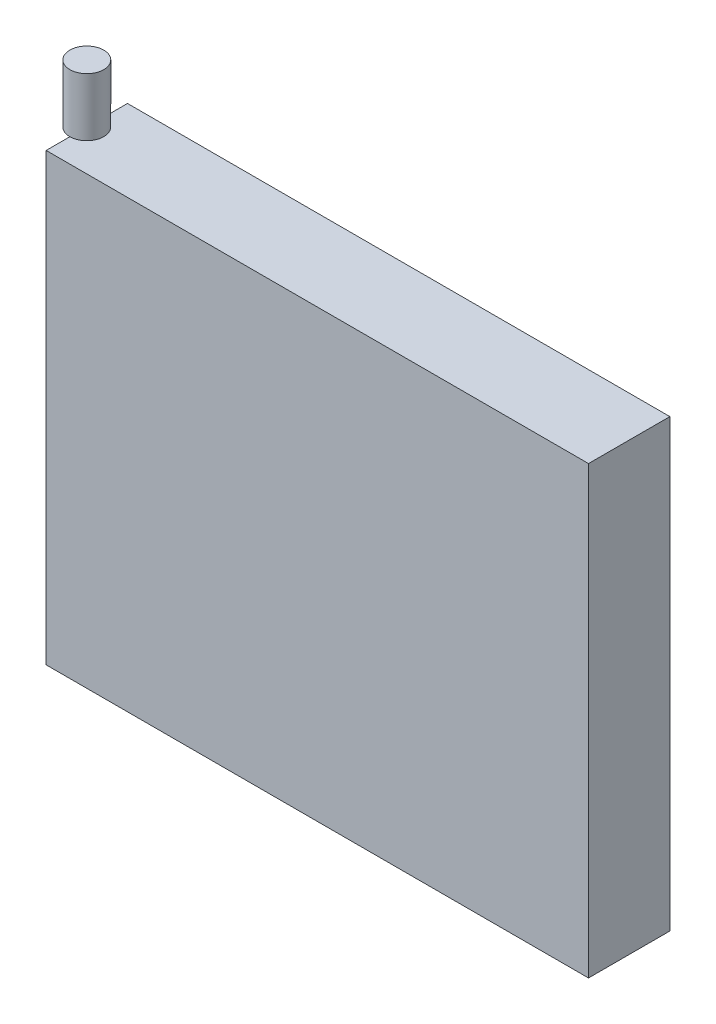
ISO-10303-21;
HEADER;
FILE_DESCRIPTION(('STEP AP214'),'2;1');
FILE_NAME('part.step','',(''),(''),'','','');
FILE_SCHEMA(('AUTOMOTIVE_DESIGN { 1 0 10303 214 1 1 1 1 }'));
ENDSEC;
DATA;
#1=APPLICATION_CONTEXT('core data for automotive mechanical design processes');
#2=APPLICATION_PROTOCOL_DEFINITION('international standard','automotive_design',2000,#1);
#3=PRODUCT_CONTEXT('',#1,'mechanical');
#4=PRODUCT('Part','Part','',(#3));
#5=PRODUCT_RELATED_PRODUCT_CATEGORY('part','',(#4));
#6=PRODUCT_DEFINITION_FORMATION('','',#4);
#7=PRODUCT_DEFINITION_CONTEXT('part definition',#1,'design');
#8=PRODUCT_DEFINITION('design','',#6,#7);
#9=PRODUCT_DEFINITION_SHAPE('','',#8);
#10=(LENGTH_UNIT() NAMED_UNIT(*) SI_UNIT(.MILLI.,.METRE.));
#11=(NAMED_UNIT(*) PLANE_ANGLE_UNIT() SI_UNIT($,.RADIAN.));
#12=(NAMED_UNIT(*) SI_UNIT($,.STERADIAN.) SOLID_ANGLE_UNIT());
#13=UNCERTAINTY_MEASURE_WITH_UNIT(LENGTH_MEASURE(1.E-05),#10,'distance_accuracy_value','');
#14=(GEOMETRIC_REPRESENTATION_CONTEXT(3) GLOBAL_UNCERTAINTY_ASSIGNED_CONTEXT((#13)) GLOBAL_UNIT_ASSIGNED_CONTEXT((#10,
#11,#12)) REPRESENTATION_CONTEXT('',''));
#15=CARTESIAN_POINT('',(0.,0.,0.));
#16=DIRECTION('',(0.,0.,1.));
#17=DIRECTION('',(1.,0.,0.));
#18=AXIS2_PLACEMENT_3D('',#15,#16,#17);
#19=CARTESIAN_POINT('',(0.,115.,21.));
#20=DIRECTION('',(0.,-1.,0.));
#21=DIRECTION('',(0.,0.,-1.));
#22=AXIS2_PLACEMENT_3D('',#19,#20,#21);
#23=PLANE('',#22);
#24=CARTESIAN_POINT('',(0.,115.,10.5));
#25=DIRECTION('',(0.,1.,0.));
#26=DIRECTION('',(0.,0.,1.));
#27=AXIS2_PLACEMENT_3D('',#24,#25,#26);
#28=CIRCLE('',#27,4.37410724330755);
#29=CARTESIAN_POINT('',(0.,115.,14.8741072433076));
#30=VERTEX_POINT('',#29);
#31=CARTESIAN_POINT('',(0.,115.,6.12589275669245));
#32=VERTEX_POINT('',#31);
#33=EDGE_CURVE('E52',#30,#32,#28,.T.);
#34=ORIENTED_EDGE('',*,*,#33,.F.);
#35=DIRECTION('',(0.,0.,-1.));
#36=VECTOR('',#35,1.);
#37=CARTESIAN_POINT('',(0.,115.,21.));
#38=LINE('',#37,#36);
#39=CARTESIAN_POINT('',(0.,115.,21.));
#40=VERTEX_POINT('',#39);
#41=EDGE_CURVE('E93',#40,#30,#38,.T.);
#42=ORIENTED_EDGE('',*,*,#41,.F.);
#43=DIRECTION('',(-1.,0.,0.));
#44=VECTOR('',#43,1.);
#45=CARTESIAN_POINT('',(0.,115.,21.));
#46=LINE('',#45,#44);
#47=CARTESIAN_POINT('',(140.,115.,21.));
#48=VERTEX_POINT('',#47);
#49=EDGE_CURVE('E61',#48,#40,#46,.T.);
#50=ORIENTED_EDGE('',*,*,#49,.F.);
#51=DIRECTION('',(0.,0.,-1.));
#52=VECTOR('',#51,1.);
#53=CARTESIAN_POINT('',(140.,115.,21.));
#54=LINE('',#53,#52);
#55=CARTESIAN_POINT('',(140.,115.,0.));
#56=VERTEX_POINT('',#55);
#57=EDGE_CURVE('E124',#48,#56,#54,.T.);
#58=ORIENTED_EDGE('',*,*,#57,.T.);
#59=DIRECTION('',(-1.,0.,0.));
#60=VECTOR('',#59,1.);
#61=CARTESIAN_POINT('',(0.,115.,0.));
#62=LINE('',#61,#60);
#63=CARTESIAN_POINT('',(0.,115.,0.));
#64=VERTEX_POINT('',#63);
#65=EDGE_CURVE('E100',#56,#64,#62,.T.);
#66=ORIENTED_EDGE('',*,*,#65,.T.);
#67=EDGE_CURVE('E81',#32,#64,#38,.T.);
#68=ORIENTED_EDGE('',*,*,#67,.F.);
#69=EDGE_LOOP('',(#34,#42,#50,#58,#66,#68));
#70=FACE_BOUND('',#69,.T.);
#71=ADVANCED_FACE('F37',(#70),#23,.F.);
#72=CARTESIAN_POINT('',(0.,0.,21.));
#73=DIRECTION('',(1.,0.,0.));
#74=DIRECTION('',(0.,0.,-1.));
#75=AXIS2_PLACEMENT_3D('',#72,#73,#74);
#76=PLANE('',#75);
#77=DIRECTION('',(0.,-1.,0.));
#78=VECTOR('',#77,1.);
#79=CARTESIAN_POINT('',(0.,0.,0.));
#80=LINE('',#79,#78);
#81=CARTESIAN_POINT('',(0.,0.,0.));
#82=VERTEX_POINT('',#81);
#83=EDGE_CURVE('E109',#64,#82,#80,.T.);
#84=ORIENTED_EDGE('',*,*,#83,.T.);
#85=DIRECTION('',(0.,0.,-1.));
#86=VECTOR('',#85,1.);
#87=CARTESIAN_POINT('',(0.,0.,21.));
#88=LINE('',#87,#86);
#89=CARTESIAN_POINT('',(0.,0.,21.));
#90=VERTEX_POINT('',#89);
#91=EDGE_CURVE('E11',#90,#82,#88,.T.);
#92=ORIENTED_EDGE('',*,*,#91,.F.);
#93=DIRECTION('',(0.,-1.,0.));
#94=VECTOR('',#93,1.);
#95=CARTESIAN_POINT('',(0.,0.,21.));
#96=LINE('',#95,#94);
#97=EDGE_CURVE('E112',#40,#90,#96,.T.);
#98=ORIENTED_EDGE('',*,*,#97,.F.);
#99=ORIENTED_EDGE('',*,*,#41,.T.);
#100=EDGE_CURVE('E91',#30,#32,#38,.T.);
#101=ORIENTED_EDGE('',*,*,#100,.T.);
#102=ORIENTED_EDGE('',*,*,#67,.T.);
#103=EDGE_LOOP('',(#84,#92,#98,#99,#101,#102));
#104=FACE_BOUND('',#103,.T.);
#105=ADVANCED_FACE('F39',(#104),#76,.F.);
#106=CARTESIAN_POINT('',(0.,0.,21.));
#107=DIRECTION('',(0.,1.,0.));
#108=DIRECTION('',(0.,0.,1.));
#109=AXIS2_PLACEMENT_3D('',#106,#107,#108);
#110=PLANE('',#109);
#111=DIRECTION('',(1.,0.,0.));
#112=VECTOR('',#111,1.);
#113=CARTESIAN_POINT('',(0.,0.,0.));
#114=LINE('',#113,#112);
#115=CARTESIAN_POINT('',(140.,0.,0.));
#116=VERTEX_POINT('',#115);
#117=EDGE_CURVE('E119',#82,#116,#114,.T.);
#118=ORIENTED_EDGE('',*,*,#117,.T.);
#119=DIRECTION('',(0.,0.,-1.));
#120=VECTOR('',#119,1.);
#121=CARTESIAN_POINT('',(140.,0.,21.));
#122=LINE('',#121,#120);
#123=CARTESIAN_POINT('',(140.,0.,21.));
#124=VERTEX_POINT('',#123);
#125=EDGE_CURVE('E45',#124,#116,#122,.T.);
#126=ORIENTED_EDGE('',*,*,#125,.F.);
#127=DIRECTION('',(1.,0.,0.));
#128=VECTOR('',#127,1.);
#129=CARTESIAN_POINT('',(0.,0.,21.));
#130=LINE('',#129,#128);
#131=EDGE_CURVE('E88',#90,#124,#130,.T.);
#132=ORIENTED_EDGE('',*,*,#131,.F.);
#133=ORIENTED_EDGE('',*,*,#91,.T.);
#134=EDGE_LOOP('',(#118,#126,#132,#133));
#135=FACE_BOUND('',#134,.T.);
#136=ADVANCED_FACE('F134',(#135),#110,.F.);
#137=CARTESIAN_POINT('',(140.,0.,21.));
#138=DIRECTION('',(-1.,0.,0.));
#139=DIRECTION('',(0.,0.,1.));
#140=AXIS2_PLACEMENT_3D('',#137,#138,#139);
#141=PLANE('',#140);
#142=DIRECTION('',(0.,1.,0.));
#143=VECTOR('',#142,1.);
#144=CARTESIAN_POINT('',(140.,0.,0.));
#145=LINE('',#144,#143);
#146=EDGE_CURVE('E121',#116,#56,#145,.T.);
#147=ORIENTED_EDGE('',*,*,#146,.T.);
#148=ORIENTED_EDGE('',*,*,#57,.F.);
#149=DIRECTION('',(0.,1.,0.));
#150=VECTOR('',#149,1.);
#151=CARTESIAN_POINT('',(140.,0.,21.));
#152=LINE('',#151,#150);
#153=EDGE_CURVE('E115',#124,#48,#152,.T.);
#154=ORIENTED_EDGE('',*,*,#153,.F.);
#155=ORIENTED_EDGE('',*,*,#125,.T.);
#156=EDGE_LOOP('',(#147,#148,#154,#155));
#157=FACE_BOUND('',#156,.T.);
#158=ADVANCED_FACE('F129',(#157),#141,.F.);
#159=CARTESIAN_POINT('',(0.,0.,21.));
#160=DIRECTION('',(0.,0.,-1.));
#161=DIRECTION('',(-1.,0.,0.));
#162=AXIS2_PLACEMENT_3D('',#159,#160,#161);
#163=PLANE('',#162);
#164=ORIENTED_EDGE('',*,*,#97,.T.);
#165=ORIENTED_EDGE('',*,*,#131,.T.);
#166=ORIENTED_EDGE('',*,*,#153,.T.);
#167=ORIENTED_EDGE('',*,*,#49,.T.);
#168=EDGE_LOOP('',(#164,#165,#166,#167));
#169=FACE_BOUND('',#168,.T.);
#170=ADVANCED_FACE('F140',(#169),#163,.F.);
#171=CARTESIAN_POINT('',(0.,0.,0.));
#172=DIRECTION('',(0.,0.,-1.));
#173=DIRECTION('',(-1.,0.,0.));
#174=AXIS2_PLACEMENT_3D('',#171,#172,#173);
#175=PLANE('',#174);
#176=ORIENTED_EDGE('',*,*,#83,.F.);
#177=ORIENTED_EDGE('',*,*,#65,.F.);
#178=ORIENTED_EDGE('',*,*,#146,.F.);
#179=ORIENTED_EDGE('',*,*,#117,.F.);
#180=EDGE_LOOP('',(#176,#177,#178,#179));
#181=FACE_BOUND('',#180,.T.);
#182=ADVANCED_FACE('F132',(#181),#175,.T.);
#183=CARTESIAN_POINT('',(0.,130.,10.5));
#184=DIRECTION('',(0.,-1.,0.));
#185=DIRECTION('',(0.,0.,-1.));
#186=AXIS2_PLACEMENT_3D('',#183,#184,#185);
#187=CYLINDRICAL_SURFACE('',#186,4.37410724330755);
#188=CARTESIAN_POINT('',(0.,130.,10.5));
#189=DIRECTION('',(0.,1.,0.));
#190=DIRECTION('',(0.,0.,1.));
#191=AXIS2_PLACEMENT_3D('',#188,#189,#190);
#192=CIRCLE('',#191,4.37410724330755);
#193=CARTESIAN_POINT('',(0.,130.,14.8741072433076));
#194=VERTEX_POINT('',#193);
#195=EDGE_CURVE('E107',#194,#194,#192,.T.);
#196=ORIENTED_EDGE('',*,*,#195,.F.);
#197=EDGE_LOOP('',(#196));
#198=FACE_BOUND('',#197,.T.);
#199=ORIENTED_EDGE('',*,*,#33,.T.);
#200=EDGE_CURVE('E102',#32,#30,#28,.T.);
#201=ORIENTED_EDGE('',*,*,#200,.T.);
#202=EDGE_LOOP('',(#199,#201));
#203=FACE_BOUND('',#202,.T.);
#204=ADVANCED_FACE('F106',(#198,#203),#187,.T.);
#205=CARTESIAN_POINT('',(0.,130.,10.5));
#206=DIRECTION('',(0.,1.,0.));
#207=DIRECTION('',(0.,0.,1.));
#208=AXIS2_PLACEMENT_3D('',#205,#206,#207);
#209=PLANE('',#208);
#210=ORIENTED_EDGE('',*,*,#195,.T.);
#211=EDGE_LOOP('',(#210));
#212=FACE_BOUND('',#211,.T.);
#213=ADVANCED_FACE('F153',(#212),#209,.T.);
#214=CARTESIAN_POINT('',(0.,115.,10.5));
#215=DIRECTION('',(0.,1.,0.));
#216=DIRECTION('',(0.,0.,1.));
#217=AXIS2_PLACEMENT_3D('',#214,#215,#216);
#218=PLANE('',#217);
#219=ORIENTED_EDGE('',*,*,#100,.F.);
#220=ORIENTED_EDGE('',*,*,#200,.F.);
#221=EDGE_LOOP('',(#219,#220));
#222=FACE_BOUND('',#221,.T.);
#223=ADVANCED_FACE('F103',(#222),#218,.F.);
#224=CLOSED_SHELL('',(#71,#105,#136,#158,#170,#182,#204,#213,#223));
#225=MANIFOLD_SOLID_BREP('B2',#224);
#226=ADVANCED_BREP_SHAPE_REPRESENTATION('',(#18,#225),#14);
#227=SHAPE_DEFINITION_REPRESENTATION(#9,#226);
ENDSEC;
END-ISO-10303-21;
